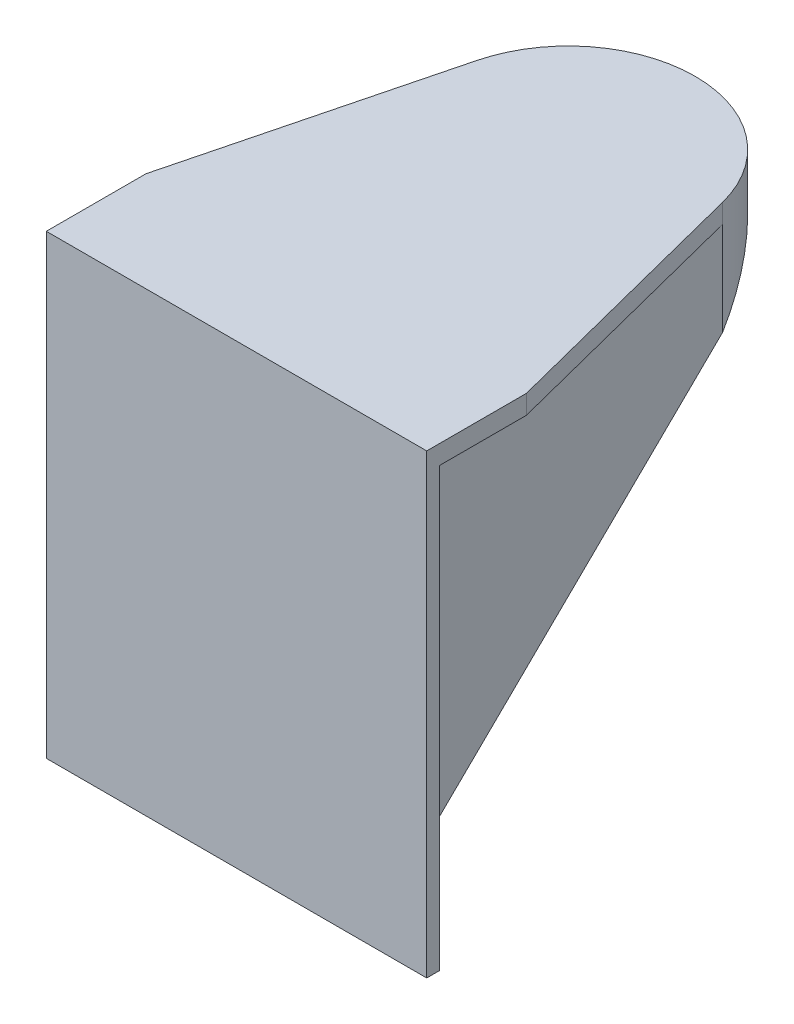
ISO-10303-21;
HEADER;
FILE_DESCRIPTION(('STEP AP214'),'2;1');
FILE_NAME('part.step','',(''),(''),'','','');
FILE_SCHEMA(('AUTOMOTIVE_DESIGN { 1 0 10303 214 1 1 1 1 }'));
ENDSEC;
DATA;
#1=APPLICATION_CONTEXT('core data for automotive mechanical design processes');
#2=APPLICATION_PROTOCOL_DEFINITION('international standard','automotive_design',2000,#1);
#3=PRODUCT_CONTEXT('',#1,'mechanical');
#4=PRODUCT('Part','Part','',(#3));
#5=PRODUCT_RELATED_PRODUCT_CATEGORY('part','',(#4));
#6=PRODUCT_DEFINITION_FORMATION('','',#4);
#7=PRODUCT_DEFINITION_CONTEXT('part definition',#1,'design');
#8=PRODUCT_DEFINITION('design','',#6,#7);
#9=PRODUCT_DEFINITION_SHAPE('','',#8);
#10=(LENGTH_UNIT() NAMED_UNIT(*) SI_UNIT(.MILLI.,.METRE.));
#11=(NAMED_UNIT(*) PLANE_ANGLE_UNIT() SI_UNIT($,.RADIAN.));
#12=(NAMED_UNIT(*) SI_UNIT($,.STERADIAN.) SOLID_ANGLE_UNIT());
#13=UNCERTAINTY_MEASURE_WITH_UNIT(LENGTH_MEASURE(1.E-05),#10,'distance_accuracy_value','');
#14=(GEOMETRIC_REPRESENTATION_CONTEXT(3) GLOBAL_UNCERTAINTY_ASSIGNED_CONTEXT((#13)) GLOBAL_UNIT_ASSIGNED_CONTEXT((#10,
#11,#12)) REPRESENTATION_CONTEXT('',''));
#15=CARTESIAN_POINT('',(0.,0.,0.));
#16=DIRECTION('',(0.,0.,1.));
#17=DIRECTION('',(1.,0.,0.));
#18=AXIS2_PLACEMENT_3D('',#15,#16,#17);
#19=CARTESIAN_POINT('',(0.,-3.,335.726435625391));
#20=DIRECTION('',(0.,-1.,0.));
#21=DIRECTION('',(0.,0.,-1.));
#22=AXIS2_PLACEMENT_3D('',#19,#20,#21);
#23=PLANE('',#22);
#24=DIRECTION('',(0.247546998799892,0.,-0.968875886471103));
#25=VECTOR('',#24,1.);
#26=CARTESIAN_POINT('',(-30.,-3.,372.350901436273));
#27=LINE('',#26,#25);
#28=CARTESIAN_POINT('',(-30.,-3.,372.350901436273));
#29=VERTEX_POINT('',#28);
#30=CARTESIAN_POINT('',(-19.3775177294221,-3.,330.775495649393));
#31=VERTEX_POINT('',#30);
#32=EDGE_CURVE('E309',#29,#31,#27,.T.);
#33=ORIENTED_EDGE('',*,*,#32,.T.);
#34=DIRECTION('',(0.,0.,-1.));
#35=VECTOR('',#34,1.);
#36=CARTESIAN_POINT('',(-19.3775177294221,-3.,386.07041555162));
#37=LINE('',#36,#35);
#38=CARTESIAN_POINT('',(-19.3775177294221,-3.,386.07041555162));
#39=VERTEX_POINT('',#38);
#40=EDGE_CURVE('E197',#39,#31,#37,.T.);
#41=ORIENTED_EDGE('',*,*,#40,.F.);
#42=DIRECTION('',(1.,0.,0.));
#43=VECTOR('',#42,1.);
#44=CARTESIAN_POINT('',(-30.,-3.,386.07041555162));
#45=LINE('',#44,#43);
#46=CARTESIAN_POINT('',(-30.,-3.,386.07041555162));
#47=VERTEX_POINT('',#46);
#48=EDGE_CURVE('E196',#47,#39,#45,.T.);
#49=ORIENTED_EDGE('',*,*,#48,.F.);
#50=DIRECTION('',(0.,0.,-1.));
#51=VECTOR('',#50,1.);
#52=CARTESIAN_POINT('',(-30.,-3.,388.07041555162));
#53=LINE('',#52,#51);
#54=EDGE_CURVE('E314',#47,#29,#53,.T.);
#55=ORIENTED_EDGE('',*,*,#54,.T.);
#56=EDGE_LOOP('',(#33,#41,#49,#55));
#57=FACE_BOUND('',#56,.T.);
#58=ADVANCED_FACE('F37',(#57),#23,.T.);
#59=CARTESIAN_POINT('',(-14.3775177294221,-3.,386.07041555162));
#60=VERTEX_POINT('',#59);
#61=CARTESIAN_POINT('',(-2.50000000000001,-3.,386.07041555162));
#62=VERTEX_POINT('',#61);
#63=EDGE_CURVE('E220',#60,#62,#45,.T.);
#64=ORIENTED_EDGE('',*,*,#63,.F.);
#65=DIRECTION('',(0.,0.,1.));
#66=VECTOR('',#65,1.);
#67=CARTESIAN_POINT('',(-14.3775177294221,-3.,386.07041555162));
#68=LINE('',#67,#66);
#69=CARTESIAN_POINT('',(-14.3775177294221,-3.,321.823666694701));
#70=VERTEX_POINT('',#69);
#71=EDGE_CURVE('E257',#70,#60,#68,.T.);
#72=ORIENTED_EDGE('',*,*,#71,.F.);
#73=CARTESIAN_POINT('',(0.,-3.,335.726435625391));
#74=DIRECTION('',(0.,-1.,0.));
#75=DIRECTION('',(0.,0.,-1.));
#76=AXIS2_PLACEMENT_3D('',#73,#74,#75);
#77=CIRCLE('',#76,20.);
#78=CARTESIAN_POINT('',(-2.50000000000001,-3.,315.883300792407));
#79=VERTEX_POINT('',#78);
#80=EDGE_CURVE('E308',#70,#79,#77,.T.);
#81=ORIENTED_EDGE('',*,*,#80,.T.);
#82=DIRECTION('',(0.,0.,-1.));
#83=VECTOR('',#82,1.);
#84=CARTESIAN_POINT('',(-2.50000000000001,-3.,386.07041555162));
#85=LINE('',#84,#83);
#86=EDGE_CURVE('E242',#62,#79,#85,.T.);
#87=ORIENTED_EDGE('',*,*,#86,.F.);
#88=EDGE_LOOP('',(#64,#72,#81,#87));
#89=FACE_BOUND('',#88,.T.);
#90=ADVANCED_FACE('F352',(#89),#23,.T.);
#91=CARTESIAN_POINT('',(-30.,-72.,386.07041555162));
#92=DIRECTION('',(0.,0.,1.));
#93=DIRECTION('',(1.,0.,0.));
#94=AXIS2_PLACEMENT_3D('',#91,#92,#93);
#95=PLANE('',#94);
#96=DIRECTION('',(0.,1.,0.));
#97=VECTOR('',#96,1.);
#98=CARTESIAN_POINT('',(-19.3775177294221,-142.521454266497,386.07041555162));
#99=LINE('',#98,#97);
#100=CARTESIAN_POINT('',(-19.3775177294221,-72.,386.07041555162));
#101=VERTEX_POINT('',#100);
#102=EDGE_CURVE('E185',#101,#39,#99,.T.);
#103=ORIENTED_EDGE('',*,*,#102,.F.);
#104=DIRECTION('',(1.,0.,0.));
#105=VECTOR('',#104,1.);
#106=CARTESIAN_POINT('',(-30.,-72.,386.07041555162));
#107=LINE('',#106,#105);
#108=CARTESIAN_POINT('',(-30.,-72.,386.07041555162));
#109=VERTEX_POINT('',#108);
#110=EDGE_CURVE('E194',#109,#101,#107,.T.);
#111=ORIENTED_EDGE('',*,*,#110,.F.);
#112=DIRECTION('',(0.,1.,0.));
#113=VECTOR('',#112,1.);
#114=CARTESIAN_POINT('',(-30.,-72.,386.07041555162));
#115=LINE('',#114,#113);
#116=EDGE_CURVE('E373',#109,#47,#115,.T.);
#117=ORIENTED_EDGE('',*,*,#116,.T.);
#118=ORIENTED_EDGE('',*,*,#48,.T.);
#119=EDGE_LOOP('',(#103,#111,#117,#118));
#120=FACE_BOUND('',#119,.T.);
#121=ADVANCED_FACE('F192',(#120),#95,.F.);
#122=DIRECTION('',(0.,1.,0.));
#123=VECTOR('',#122,1.);
#124=CARTESIAN_POINT('',(-14.3775177294221,-142.521454266497,386.07041555162));
#125=LINE('',#124,#123);
#126=CARTESIAN_POINT('',(-14.3775177294221,-72.,386.07041555162));
#127=VERTEX_POINT('',#126);
#128=EDGE_CURVE('E198',#127,#60,#125,.T.);
#129=ORIENTED_EDGE('',*,*,#128,.T.);
#130=ORIENTED_EDGE('',*,*,#63,.T.);
#131=DIRECTION('',(0.,1.,0.));
#132=VECTOR('',#131,1.);
#133=CARTESIAN_POINT('',(-2.50000000000001,-142.521454266497,386.07041555162));
#134=LINE('',#133,#132);
#135=CARTESIAN_POINT('',(-2.50000000000001,-72.,386.07041555162));
#136=VERTEX_POINT('',#135);
#137=EDGE_CURVE('E239',#136,#62,#134,.T.);
#138=ORIENTED_EDGE('',*,*,#137,.F.);
#139=EDGE_CURVE('E207',#127,#136,#107,.T.);
#140=ORIENTED_EDGE('',*,*,#139,.F.);
#141=EDGE_LOOP('',(#129,#130,#138,#140));
#142=FACE_BOUND('',#141,.T.);
#143=ADVANCED_FACE('F345',(#142),#95,.F.);
#144=CARTESIAN_POINT('',(2.5,-3.,315.883300792407));
#145=VERTEX_POINT('',#144);
#146=CARTESIAN_POINT('',(14.3775177294221,-3.,321.823666694701));
#147=VERTEX_POINT('',#146);
#148=EDGE_CURVE('E306',#145,#147,#77,.T.);
#149=ORIENTED_EDGE('',*,*,#148,.T.);
#150=DIRECTION('',(0.,0.,-1.));
#151=VECTOR('',#150,1.);
#152=CARTESIAN_POINT('',(14.3775177294221,-3.,386.07041555162));
#153=LINE('',#152,#151);
#154=CARTESIAN_POINT('',(14.3775177294221,-3.,386.07041555162));
#155=VERTEX_POINT('',#154);
#156=EDGE_CURVE('E256',#155,#147,#153,.T.);
#157=ORIENTED_EDGE('',*,*,#156,.F.);
#158=CARTESIAN_POINT('',(2.49999999999999,-3.,386.07041555162));
#159=VERTEX_POINT('',#158);
#160=EDGE_CURVE('E297',#159,#155,#45,.T.);
#161=ORIENTED_EDGE('',*,*,#160,.F.);
#162=DIRECTION('',(0.,0.,1.));
#163=VECTOR('',#162,1.);
#164=CARTESIAN_POINT('',(2.49999999999999,-3.,386.07041555162));
#165=LINE('',#164,#163);
#166=EDGE_CURVE('E246',#145,#159,#165,.T.);
#167=ORIENTED_EDGE('',*,*,#166,.F.);
#168=EDGE_LOOP('',(#149,#157,#161,#167));
#169=FACE_BOUND('',#168,.T.);
#170=ADVANCED_FACE('F304',(#169),#23,.T.);
#171=CARTESIAN_POINT('',(19.3775177294221,-3.,386.07041555162));
#172=VERTEX_POINT('',#171);
#173=CARTESIAN_POINT('',(30.,-3.,386.07041555162));
#174=VERTEX_POINT('',#173);
#175=EDGE_CURVE('E226',#172,#174,#45,.T.);
#176=ORIENTED_EDGE('',*,*,#175,.F.);
#177=DIRECTION('',(0.,0.,1.));
#178=VECTOR('',#177,1.);
#179=CARTESIAN_POINT('',(19.3775177294221,-3.,386.07041555162));
#180=LINE('',#179,#178);
#181=CARTESIAN_POINT('',(19.3775177294221,-3.,330.775495649393));
#182=VERTEX_POINT('',#181);
#183=EDGE_CURVE('E260',#182,#172,#180,.T.);
#184=ORIENTED_EDGE('',*,*,#183,.F.);
#185=DIRECTION('',(0.247546998799894,0.,0.968875886471103));
#186=VECTOR('',#185,1.);
#187=CARTESIAN_POINT('',(30.,-3.,372.350901436273));
#188=LINE('',#187,#186);
#189=CARTESIAN_POINT('',(30.,-3.,372.350901436273));
#190=VERTEX_POINT('',#189);
#191=EDGE_CURVE('E312',#182,#190,#188,.T.);
#192=ORIENTED_EDGE('',*,*,#191,.T.);
#193=DIRECTION('',(0.,0.,1.));
#194=VECTOR('',#193,1.);
#195=CARTESIAN_POINT('',(30.,-3.,388.07041555162));
#196=LINE('',#195,#194);
#197=EDGE_CURVE('E320',#190,#174,#196,.T.);
#198=ORIENTED_EDGE('',*,*,#197,.T.);
#199=EDGE_LOOP('',(#176,#184,#192,#198));
#200=FACE_BOUND('',#199,.T.);
#201=ADVANCED_FACE('F366',(#200),#23,.T.);
#202=DIRECTION('',(0.,1.,0.));
#203=VECTOR('',#202,1.);
#204=CARTESIAN_POINT('',(14.3775177294221,-142.521454266497,386.07041555162));
#205=LINE('',#204,#203);
#206=CARTESIAN_POINT('',(14.377517729422,-72.,386.07041555162));
#207=VERTEX_POINT('',#206);
#208=EDGE_CURVE('E254',#207,#155,#205,.T.);
#209=ORIENTED_EDGE('',*,*,#208,.F.);
#210=CARTESIAN_POINT('',(2.49999999999998,-72.,386.07041555162));
#211=VERTEX_POINT('',#210);
#212=EDGE_CURVE('E209',#211,#207,#107,.T.);
#213=ORIENTED_EDGE('',*,*,#212,.F.);
#214=DIRECTION('',(0.,1.,0.));
#215=VECTOR('',#214,1.);
#216=CARTESIAN_POINT('',(2.49999999999999,-142.521454266497,386.07041555162));
#217=LINE('',#216,#215);
#218=EDGE_CURVE('E238',#211,#159,#217,.T.);
#219=ORIENTED_EDGE('',*,*,#218,.T.);
#220=ORIENTED_EDGE('',*,*,#160,.T.);
#221=EDGE_LOOP('',(#209,#213,#219,#220));
#222=FACE_BOUND('',#221,.T.);
#223=ADVANCED_FACE('F296',(#222),#95,.F.);
#224=DIRECTION('',(0.,1.,0.));
#225=VECTOR('',#224,1.);
#226=CARTESIAN_POINT('',(19.3775177294221,-142.521454266497,386.07041555162));
#227=LINE('',#226,#225);
#228=CARTESIAN_POINT('',(19.377517729422,-72.,386.07041555162));
#229=VERTEX_POINT('',#228);
#230=EDGE_CURVE('E243',#229,#172,#227,.T.);
#231=ORIENTED_EDGE('',*,*,#230,.T.);
#232=ORIENTED_EDGE('',*,*,#175,.T.);
#233=DIRECTION('',(0.,1.,0.));
#234=VECTOR('',#233,1.);
#235=CARTESIAN_POINT('',(30.,-72.,386.07041555162));
#236=LINE('',#235,#234);
#237=CARTESIAN_POINT('',(30.,-72.,386.07041555162));
#238=VERTEX_POINT('',#237);
#239=EDGE_CURVE('E332',#238,#174,#236,.T.);
#240=ORIENTED_EDGE('',*,*,#239,.F.);
#241=EDGE_CURVE('E213',#229,#238,#107,.T.);
#242=ORIENTED_EDGE('',*,*,#241,.F.);
#243=EDGE_LOOP('',(#231,#232,#240,#242));
#244=FACE_BOUND('',#243,.T.);
#245=ADVANCED_FACE('F370',(#244),#95,.F.);
#246=CARTESIAN_POINT('',(30.,10.,372.350901436273));
#247=DIRECTION('',(-0.968875886471103,0.,0.247546998799894));
#248=DIRECTION('',(0.247546998799894,0.,0.968875886471103));
#249=AXIS2_PLACEMENT_3D('',#246,#247,#248);
#250=PLANE('',#249);
#251=DIRECTION('',(0.,-1.,0.));
#252=VECTOR('',#251,1.);
#253=CARTESIAN_POINT('',(19.3775177294221,10.,330.775495649393));
#254=LINE('',#253,#252);
#255=CARTESIAN_POINT('',(19.3775177294221,0.,330.775495649393));
#256=VERTEX_POINT('',#255);
#257=EDGE_CURVE('E359',#256,#182,#254,.T.);
#258=ORIENTED_EDGE('',*,*,#257,.F.);
#259=DIRECTION('',(0.247546998799894,0.,0.968875886471103));
#260=VECTOR('',#259,1.);
#261=CARTESIAN_POINT('',(30.,0.,372.350901436273));
#262=LINE('',#261,#260);
#263=CARTESIAN_POINT('',(30.,0.,372.350901436273));
#264=VERTEX_POINT('',#263);
#265=EDGE_CURVE('E223',#256,#264,#262,.T.);
#266=ORIENTED_EDGE('',*,*,#265,.T.);
#267=DIRECTION('',(0.,-1.,0.));
#268=VECTOR('',#267,1.);
#269=CARTESIAN_POINT('',(30.,10.,372.350901436273));
#270=LINE('',#269,#268);
#271=EDGE_CURVE('E45',#264,#190,#270,.T.);
#272=ORIENTED_EDGE('',*,*,#271,.T.);
#273=ORIENTED_EDGE('',*,*,#191,.F.);
#274=EDGE_LOOP('',(#258,#266,#272,#273));
#275=FACE_BOUND('',#274,.T.);
#276=ADVANCED_FACE('F393',(#275),#250,.F.);
#277=CARTESIAN_POINT('',(0.,10.,335.726435625391));
#278=DIRECTION('',(0.,-1.,0.));
#279=DIRECTION('',(0.,0.,-1.));
#280=AXIS2_PLACEMENT_3D('',#277,#278,#279);
#281=CYLINDRICAL_SURFACE('',#280,20.);
#282=DIRECTION('',(0.,1.,0.));
#283=VECTOR('',#282,1.);
#284=CARTESIAN_POINT('',(19.3775177294221,-142.521454266497,330.775495649393));
#285=LINE('',#284,#283);
#286=CARTESIAN_POINT('',(19.3775177294221,-17.7615352834049,330.775495649393));
#287=VERTEX_POINT('',#286);
#288=EDGE_CURVE('E261',#287,#182,#285,.T.);
#289=ORIENTED_EDGE('',*,*,#288,.F.);
#290=CARTESIAN_POINT('',(0.,-22.6178834556594,335.726435625391));
#291=DIRECTION('',(0.,0.713893657899799,0.700254129020633));
#292=DIRECTION('',(0.,-0.700254129020633,0.713893657899799));
#293=AXIS2_PLACEMENT_3D('',#290,#291,#292);
#294=ELLIPSE('',#293,28.015377050467,20.);
#295=CARTESIAN_POINT('',(14.3775177294221,-8.98073842599767,321.823666694701));
#296=VERTEX_POINT('',#295);
#297=EDGE_CURVE('E60',#287,#296,#294,.T.);
#298=ORIENTED_EDGE('',*,*,#297,.T.);
#299=DIRECTION('',(0.,1.,0.));
#300=VECTOR('',#299,1.);
#301=CARTESIAN_POINT('',(14.3775177294221,-142.521454266497,321.823666694701));
#302=LINE('',#301,#300);
#303=EDGE_CURVE('E263',#296,#147,#302,.T.);
#304=ORIENTED_EDGE('',*,*,#303,.T.);
#305=ORIENTED_EDGE('',*,*,#148,.F.);
#306=DIRECTION('',(0.,1.,0.));
#307=VECTOR('',#306,1.);
#308=CARTESIAN_POINT('',(2.5,-142.521454266497,315.883300792407));
#309=LINE('',#308,#307);
#310=CARTESIAN_POINT('',(2.5,-3.1538681282382,315.883300792407));
#311=VERTEX_POINT('',#310);
#312=EDGE_CURVE('E247',#311,#145,#309,.T.);
#313=ORIENTED_EDGE('',*,*,#312,.F.);
#314=CARTESIAN_POINT('',(-2.50000000000001,-3.1538681282382,315.883300792407));
#315=VERTEX_POINT('',#314);
#316=EDGE_CURVE('E52',#311,#315,#294,.T.);
#317=ORIENTED_EDGE('',*,*,#316,.T.);
#318=DIRECTION('',(0.,1.,0.));
#319=VECTOR('',#318,1.);
#320=CARTESIAN_POINT('',(-2.50000000000001,-142.521454266497,315.883300792407));
#321=LINE('',#320,#319);
#322=EDGE_CURVE('E249',#315,#79,#321,.T.);
#323=ORIENTED_EDGE('',*,*,#322,.T.);
#324=ORIENTED_EDGE('',*,*,#80,.F.);
#325=DIRECTION('',(0.,1.,0.));
#326=VECTOR('',#325,1.);
#327=CARTESIAN_POINT('',(-14.3775177294221,-142.521454266497,321.823666694701));
#328=LINE('',#327,#326);
#329=CARTESIAN_POINT('',(-14.3775177294221,-8.98073842599768,321.823666694701));
#330=VERTEX_POINT('',#329);
#331=EDGE_CURVE('E271',#330,#70,#328,.T.);
#332=ORIENTED_EDGE('',*,*,#331,.F.);
#333=CARTESIAN_POINT('',(-19.3775177294221,-17.7615352834049,330.775495649393));
#334=VERTEX_POINT('',#333);
#335=EDGE_CURVE('E176',#330,#334,#294,.T.);
#336=ORIENTED_EDGE('',*,*,#335,.T.);
#337=DIRECTION('',(0.,1.,0.));
#338=VECTOR('',#337,1.);
#339=CARTESIAN_POINT('',(-19.3775177294221,-142.521454266497,330.775495649393));
#340=LINE('',#339,#338);
#341=EDGE_CURVE('E187',#334,#31,#340,.T.);
#342=ORIENTED_EDGE('',*,*,#341,.T.);
#343=DIRECTION('',(0.,-1.,0.));
#344=VECTOR('',#343,1.);
#345=CARTESIAN_POINT('',(-19.3775177294221,10.,330.775495649393));
#346=LINE('',#345,#344);
#347=CARTESIAN_POINT('',(-19.3775177294221,0.,330.775495649393));
#348=VERTEX_POINT('',#347);
#349=EDGE_CURVE('E389',#348,#31,#346,.T.);
#350=ORIENTED_EDGE('',*,*,#349,.F.);
#351=CARTESIAN_POINT('',(0.,0.,335.726435625391));
#352=DIRECTION('',(0.,-1.,0.));
#353=DIRECTION('',(0.,0.,-1.));
#354=AXIS2_PLACEMENT_3D('',#351,#352,#353);
#355=CIRCLE('',#354,20.);
#356=EDGE_CURVE('E227',#348,#256,#355,.T.);
#357=ORIENTED_EDGE('',*,*,#356,.T.);
#358=ORIENTED_EDGE('',*,*,#257,.T.);
#359=EDGE_LOOP('',(#289,#298,#304,#305,#313,#317,#323,#324,#332,#336,#342,#350,#357,#358));
#360=FACE_BOUND('',#359,.T.);
#361=ADVANCED_FACE('F356',(#360),#281,.T.);
#362=CARTESIAN_POINT('',(-30.,10.,372.350901436273));
#363=DIRECTION('',(0.968875886471103,0.,0.247546998799892));
#364=DIRECTION('',(0.247546998799892,0.,-0.968875886471103));
#365=AXIS2_PLACEMENT_3D('',#362,#363,#364);
#366=PLANE('',#365);
#367=DIRECTION('',(0.,-1.,0.));
#368=VECTOR('',#367,1.);
#369=CARTESIAN_POINT('',(-30.,10.,372.350901436273));
#370=LINE('',#369,#368);
#371=CARTESIAN_POINT('',(-30.,0.,372.350901436273));
#372=VERTEX_POINT('',#371);
#373=EDGE_CURVE('E385',#372,#29,#370,.T.);
#374=ORIENTED_EDGE('',*,*,#373,.F.);
#375=DIRECTION('',(0.247546998799892,0.,-0.968875886471103));
#376=VECTOR('',#375,1.);
#377=CARTESIAN_POINT('',(-30.,0.,372.350901436273));
#378=LINE('',#377,#376);
#379=EDGE_CURVE('E230',#372,#348,#378,.T.);
#380=ORIENTED_EDGE('',*,*,#379,.T.);
#381=ORIENTED_EDGE('',*,*,#349,.T.);
#382=ORIENTED_EDGE('',*,*,#32,.F.);
#383=EDGE_LOOP('',(#374,#380,#381,#382));
#384=FACE_BOUND('',#383,.T.);
#385=ADVANCED_FACE('F405',(#384),#366,.F.);
#386=CARTESIAN_POINT('',(-30.,15.,372.350901436273));
#387=DIRECTION('',(1.,0.,0.));
#388=DIRECTION('',(0.,0.,-1.));
#389=AXIS2_PLACEMENT_3D('',#386,#387,#388);
#390=PLANE('',#389);
#391=DIRECTION('',(0.,1.,0.));
#392=VECTOR('',#391,1.);
#393=CARTESIAN_POINT('',(-30.,-3.,388.07041555162));
#394=LINE('',#393,#392);
#395=CARTESIAN_POINT('',(-30.,-72.,388.07041555162));
#396=VERTEX_POINT('',#395);
#397=CARTESIAN_POINT('',(-30.,0.,388.07041555162));
#398=VERTEX_POINT('',#397);
#399=EDGE_CURVE('E328',#396,#398,#394,.T.);
#400=ORIENTED_EDGE('',*,*,#399,.T.);
#401=DIRECTION('',(0.,0.,1.));
#402=VECTOR('',#401,1.);
#403=CARTESIAN_POINT('',(-30.,0.,408.07041555162));
#404=LINE('',#403,#402);
#405=EDGE_CURVE('E235',#372,#398,#404,.T.);
#406=ORIENTED_EDGE('',*,*,#405,.F.);
#407=ORIENTED_EDGE('',*,*,#373,.T.);
#408=ORIENTED_EDGE('',*,*,#54,.F.);
#409=ORIENTED_EDGE('',*,*,#116,.F.);
#410=DIRECTION('',(0.,0.,-1.));
#411=VECTOR('',#410,1.);
#412=CARTESIAN_POINT('',(-30.,-72.,388.07041555162));
#413=LINE('',#412,#411);
#414=EDGE_CURVE('E204',#396,#109,#413,.T.);
#415=ORIENTED_EDGE('',*,*,#414,.F.);
#416=EDGE_LOOP('',(#400,#406,#407,#408,#409,#415));
#417=FACE_BOUND('',#416,.T.);
#418=ADVANCED_FACE('F39',(#417),#390,.F.);
#419=CARTESIAN_POINT('',(30.,15.,372.350901436273));
#420=DIRECTION('',(-1.,0.,0.));
#421=DIRECTION('',(0.,0.,1.));
#422=AXIS2_PLACEMENT_3D('',#419,#420,#421);
#423=PLANE('',#422);
#424=ORIENTED_EDGE('',*,*,#271,.F.);
#425=DIRECTION('',(0.,0.,-1.));
#426=VECTOR('',#425,1.);
#427=CARTESIAN_POINT('',(30.,0.,408.07041555162));
#428=LINE('',#427,#426);
#429=CARTESIAN_POINT('',(30.,0.,388.07041555162));
#430=VERTEX_POINT('',#429);
#431=EDGE_CURVE('E233',#430,#264,#428,.T.);
#432=ORIENTED_EDGE('',*,*,#431,.F.);
#433=DIRECTION('',(0.,1.,0.));
#434=VECTOR('',#433,1.);
#435=CARTESIAN_POINT('',(30.,-3.,388.07041555162));
#436=LINE('',#435,#434);
#437=CARTESIAN_POINT('',(30.,-72.,388.07041555162));
#438=VERTEX_POINT('',#437);
#439=EDGE_CURVE('E378',#438,#430,#436,.T.);
#440=ORIENTED_EDGE('',*,*,#439,.F.);
#441=DIRECTION('',(0.,0.,1.));
#442=VECTOR('',#441,1.);
#443=CARTESIAN_POINT('',(30.,-72.,388.07041555162));
#444=LINE('',#443,#442);
#445=EDGE_CURVE('E206',#238,#438,#444,.T.);
#446=ORIENTED_EDGE('',*,*,#445,.F.);
#447=ORIENTED_EDGE('',*,*,#239,.T.);
#448=ORIENTED_EDGE('',*,*,#197,.F.);
#449=EDGE_LOOP('',(#424,#432,#440,#446,#447,#448));
#450=FACE_BOUND('',#449,.T.);
#451=ADVANCED_FACE('F375',(#450),#423,.F.);
#452=CARTESIAN_POINT('',(0.,0.,335.726435625391));
#453=DIRECTION('',(0.,-1.,0.));
#454=DIRECTION('',(0.,0.,-1.));
#455=AXIS2_PLACEMENT_3D('',#452,#453,#454);
#456=PLANE('',#455);
#457=ORIENTED_EDGE('',*,*,#405,.T.);
#458=DIRECTION('',(-1.,0.,0.));
#459=VECTOR('',#458,1.);
#460=CARTESIAN_POINT('',(-30.,0.,388.07041555162));
#461=LINE('',#460,#459);
#462=EDGE_CURVE('E323',#430,#398,#461,.T.);
#463=ORIENTED_EDGE('',*,*,#462,.F.);
#464=ORIENTED_EDGE('',*,*,#431,.T.);
#465=ORIENTED_EDGE('',*,*,#265,.F.);
#466=ORIENTED_EDGE('',*,*,#356,.F.);
#467=ORIENTED_EDGE('',*,*,#379,.F.);
#468=EDGE_LOOP('',(#457,#463,#464,#465,#466,#467));
#469=FACE_BOUND('',#468,.T.);
#470=ADVANCED_FACE('F395',(#469),#456,.F.);
#471=CARTESIAN_POINT('',(-30.,-3.,388.07041555162));
#472=DIRECTION('',(0.,0.,-1.));
#473=DIRECTION('',(-1.,0.,0.));
#474=AXIS2_PLACEMENT_3D('',#471,#472,#473);
#475=PLANE('',#474);
#476=ORIENTED_EDGE('',*,*,#462,.T.);
#477=ORIENTED_EDGE('',*,*,#399,.F.);
#478=DIRECTION('',(-1.,0.,0.));
#479=VECTOR('',#478,1.);
#480=CARTESIAN_POINT('',(-30.,-72.,388.07041555162));
#481=LINE('',#480,#479);
#482=EDGE_CURVE('E211',#438,#396,#481,.T.);
#483=ORIENTED_EDGE('',*,*,#482,.F.);
#484=ORIENTED_EDGE('',*,*,#439,.T.);
#485=EDGE_LOOP('',(#476,#477,#483,#484));
#486=FACE_BOUND('',#485,.T.);
#487=ADVANCED_FACE('F381',(#486),#475,.F.);
#488=CARTESIAN_POINT('',(0.,-72.,0.));
#489=DIRECTION('',(0.,-1.,0.));
#490=DIRECTION('',(0.,0.,-1.));
#491=AXIS2_PLACEMENT_3D('',#488,#489,#490);
#492=PLANE('',#491);
#493=DIRECTION('',(1.,0.,0.));
#494=VECTOR('',#493,1.);
#495=CARTESIAN_POINT('',(-30.00005,-72.,386.07041555162));
#496=LINE('',#495,#494);
#497=EDGE_CURVE('E179',#207,#229,#496,.T.);
#498=ORIENTED_EDGE('',*,*,#497,.T.);
#499=ORIENTED_EDGE('',*,*,#241,.T.);
#500=ORIENTED_EDGE('',*,*,#445,.T.);
#501=ORIENTED_EDGE('',*,*,#482,.T.);
#502=ORIENTED_EDGE('',*,*,#414,.T.);
#503=ORIENTED_EDGE('',*,*,#110,.T.);
#504=EDGE_CURVE('E167',#101,#127,#496,.T.);
#505=ORIENTED_EDGE('',*,*,#504,.T.);
#506=ORIENTED_EDGE('',*,*,#139,.T.);
#507=EDGE_CURVE('E177',#136,#211,#496,.T.);
#508=ORIENTED_EDGE('',*,*,#507,.T.);
#509=ORIENTED_EDGE('',*,*,#212,.T.);
#510=EDGE_LOOP('',(#498,#499,#500,#501,#502,#503,#505,#506,#508,#509));
#511=FACE_BOUND('',#510,.T.);
#512=ADVANCED_FACE('F201',(#511),#492,.T.);
#513=CARTESIAN_POINT('',(-2.50000000000001,-142.521454266497,386.07041555162));
#514=DIRECTION('',(1.,0.,0.));
#515=DIRECTION('',(0.,0.,-1.));
#516=AXIS2_PLACEMENT_3D('',#513,#514,#515);
#517=PLANE('',#516);
#518=ORIENTED_EDGE('',*,*,#322,.F.);
#519=DIRECTION('',(0.,-0.700254129020633,0.713893657899799));
#520=VECTOR('',#519,1.);
#521=CARTESIAN_POINT('',(-2.50000000000001,-106.580607312318,421.324582893859));
#522=LINE('',#521,#520);
#523=EDGE_CURVE('E270',#315,#136,#522,.T.);
#524=ORIENTED_EDGE('',*,*,#523,.T.);
#525=ORIENTED_EDGE('',*,*,#137,.T.);
#526=ORIENTED_EDGE('',*,*,#86,.T.);
#527=EDGE_LOOP('',(#518,#524,#525,#526));
#528=FACE_BOUND('',#527,.T.);
#529=ADVANCED_FACE('F351',(#528),#517,.F.);
#530=CARTESIAN_POINT('',(2.49999999999999,-142.521454266497,386.07041555162));
#531=DIRECTION('',(-1.,0.,0.));
#532=DIRECTION('',(0.,0.,1.));
#533=AXIS2_PLACEMENT_3D('',#530,#531,#532);
#534=PLANE('',#533);
#535=ORIENTED_EDGE('',*,*,#218,.F.);
#536=DIRECTION('',(0.,0.700254129020633,-0.713893657899799));
#537=VECTOR('',#536,1.);
#538=CARTESIAN_POINT('',(2.49999999999999,-106.580607312318,421.324582893859));
#539=LINE('',#538,#537);
#540=EDGE_CURVE('E278',#211,#311,#539,.T.);
#541=ORIENTED_EDGE('',*,*,#540,.T.);
#542=ORIENTED_EDGE('',*,*,#312,.T.);
#543=ORIENTED_EDGE('',*,*,#166,.T.);
#544=EDGE_LOOP('',(#535,#541,#542,#543));
#545=FACE_BOUND('',#544,.T.);
#546=ADVANCED_FACE('F289',(#545),#534,.F.);
#547=CARTESIAN_POINT('',(14.3775177294221,-142.521454266497,386.07041555162));
#548=DIRECTION('',(1.,0.,0.));
#549=DIRECTION('',(0.,0.,-1.));
#550=AXIS2_PLACEMENT_3D('',#547,#548,#549);
#551=PLANE('',#550);
#552=ORIENTED_EDGE('',*,*,#303,.F.);
#553=DIRECTION('',(0.,-0.700254129020633,0.713893657899799));
#554=VECTOR('',#553,1.);
#555=CARTESIAN_POINT('',(14.3775177294221,-106.580607312318,421.324582893859));
#556=LINE('',#555,#554);
#557=EDGE_CURVE('E280',#296,#207,#556,.T.);
#558=ORIENTED_EDGE('',*,*,#557,.T.);
#559=ORIENTED_EDGE('',*,*,#208,.T.);
#560=ORIENTED_EDGE('',*,*,#156,.T.);
#561=EDGE_LOOP('',(#552,#558,#559,#560));
#562=FACE_BOUND('',#561,.T.);
#563=ADVANCED_FACE('F301',(#562),#551,.F.);
#564=CARTESIAN_POINT('',(19.3775177294221,-142.521454266497,386.07041555162));
#565=DIRECTION('',(-1.,0.,0.));
#566=DIRECTION('',(0.,0.,1.));
#567=AXIS2_PLACEMENT_3D('',#564,#565,#566);
#568=PLANE('',#567);
#569=ORIENTED_EDGE('',*,*,#230,.F.);
#570=DIRECTION('',(0.,0.700254129020633,-0.713893657899799));
#571=VECTOR('',#570,1.);
#572=CARTESIAN_POINT('',(19.3775177294221,-106.580607312318,421.324582893859));
#573=LINE('',#572,#571);
#574=EDGE_CURVE('E188',#229,#287,#573,.T.);
#575=ORIENTED_EDGE('',*,*,#574,.T.);
#576=ORIENTED_EDGE('',*,*,#288,.T.);
#577=ORIENTED_EDGE('',*,*,#183,.T.);
#578=EDGE_LOOP('',(#569,#575,#576,#577));
#579=FACE_BOUND('',#578,.T.);
#580=ADVANCED_FACE('F363',(#579),#568,.F.);
#581=CARTESIAN_POINT('',(-19.3775177294221,-142.521454266497,386.07041555162));
#582=DIRECTION('',(1.,0.,0.));
#583=DIRECTION('',(0.,0.,-1.));
#584=AXIS2_PLACEMENT_3D('',#581,#582,#583);
#585=PLANE('',#584);
#586=ORIENTED_EDGE('',*,*,#341,.F.);
#587=DIRECTION('',(0.,-0.700254129020633,0.713893657899799));
#588=VECTOR('',#587,1.);
#589=CARTESIAN_POINT('',(-19.3775177294221,-106.580607312318,421.324582893859));
#590=LINE('',#589,#588);
#591=EDGE_CURVE('E170',#334,#101,#590,.T.);
#592=ORIENTED_EDGE('',*,*,#591,.T.);
#593=ORIENTED_EDGE('',*,*,#102,.T.);
#594=ORIENTED_EDGE('',*,*,#40,.T.);
#595=EDGE_LOOP('',(#586,#592,#593,#594));
#596=FACE_BOUND('',#595,.T.);
#597=ADVANCED_FACE('F183',(#596),#585,.F.);
#598=CARTESIAN_POINT('',(-14.3775177294221,-142.521454266497,386.07041555162));
#599=DIRECTION('',(-1.,0.,0.));
#600=DIRECTION('',(0.,0.,1.));
#601=AXIS2_PLACEMENT_3D('',#598,#599,#600);
#602=PLANE('',#601);
#603=ORIENTED_EDGE('',*,*,#128,.F.);
#604=DIRECTION('',(0.,0.700254129020633,-0.713893657899799));
#605=VECTOR('',#604,1.);
#606=CARTESIAN_POINT('',(-14.3775177294221,-106.580607312318,421.324582893859));
#607=LINE('',#606,#605);
#608=EDGE_CURVE('E12',#127,#330,#607,.T.);
#609=ORIENTED_EDGE('',*,*,#608,.T.);
#610=ORIENTED_EDGE('',*,*,#331,.T.);
#611=ORIENTED_EDGE('',*,*,#71,.T.);
#612=EDGE_LOOP('',(#603,#609,#610,#611));
#613=FACE_BOUND('',#612,.T.);
#614=ADVANCED_FACE('F408',(#613),#602,.F.);
#615=CARTESIAN_POINT('',(-30.00005,-3.,315.726435625391));
#616=DIRECTION('',(0.,0.713893657899799,0.700254129020633));
#617=DIRECTION('',(0.,-0.700254129020633,0.713893657899799));
#618=AXIS2_PLACEMENT_3D('',#615,#616,#617);
#619=PLANE('',#618);
#620=ORIENTED_EDGE('',*,*,#335,.F.);
#621=ORIENTED_EDGE('',*,*,#608,.F.);
#622=ORIENTED_EDGE('',*,*,#504,.F.);
#623=ORIENTED_EDGE('',*,*,#591,.F.);
#624=EDGE_LOOP('',(#620,#621,#622,#623));
#625=FACE_BOUND('',#624,.T.);
#626=ADVANCED_FACE('F169',(#625),#619,.F.);
#627=ORIENTED_EDGE('',*,*,#297,.F.);
#628=ORIENTED_EDGE('',*,*,#574,.F.);
#629=ORIENTED_EDGE('',*,*,#497,.F.);
#630=ORIENTED_EDGE('',*,*,#557,.F.);
#631=EDGE_LOOP('',(#627,#628,#629,#630));
#632=FACE_BOUND('',#631,.T.);
#633=ADVANCED_FACE('F415',(#632),#619,.F.);
#634=ORIENTED_EDGE('',*,*,#316,.F.);
#635=ORIENTED_EDGE('',*,*,#540,.F.);
#636=ORIENTED_EDGE('',*,*,#507,.F.);
#637=ORIENTED_EDGE('',*,*,#523,.F.);
#638=EDGE_LOOP('',(#634,#635,#636,#637));
#639=FACE_BOUND('',#638,.T.);
#640=ADVANCED_FACE('F417',(#639),#619,.F.);
#641=CLOSED_SHELL('',(#58,#90,#121,#143,#170,#201,#223,#245,#276,#361,#385,#418,#451,#470,#487,
#512,#529,#546,#563,#580,#597,#614,#626,#633,#640));
#642=MANIFOLD_SOLID_BREP('B2',#641);
#643=ADVANCED_BREP_SHAPE_REPRESENTATION('',(#18,#642),#14);
#644=SHAPE_DEFINITION_REPRESENTATION(#9,#643);
ENDSEC;
END-ISO-10303-21;
